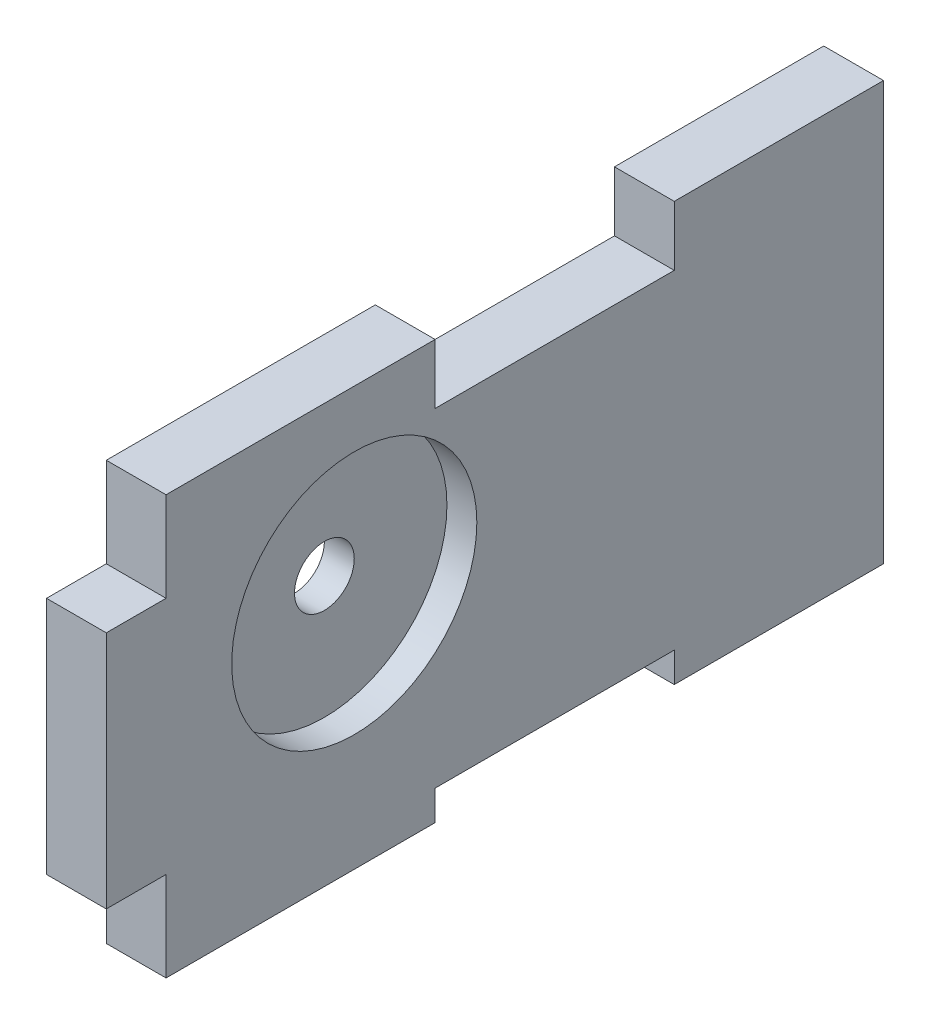
ISO-10303-21;
HEADER;
FILE_DESCRIPTION(('STEP AP214'),'2;1');
FILE_NAME('part.step','',(''),(''),'','','');
FILE_SCHEMA(('AUTOMOTIVE_DESIGN { 1 0 10303 214 1 1 1 1 }'));
ENDSEC;
DATA;
#1=APPLICATION_CONTEXT('core data for automotive mechanical design processes');
#2=APPLICATION_PROTOCOL_DEFINITION('international standard','automotive_design',2000,#1);
#3=PRODUCT_CONTEXT('',#1,'mechanical');
#4=PRODUCT('Part','Part','',(#3));
#5=PRODUCT_RELATED_PRODUCT_CATEGORY('part','',(#4));
#6=PRODUCT_DEFINITION_FORMATION('','',#4);
#7=PRODUCT_DEFINITION_CONTEXT('part definition',#1,'design');
#8=PRODUCT_DEFINITION('design','',#6,#7);
#9=PRODUCT_DEFINITION_SHAPE('','',#8);
#10=(LENGTH_UNIT() NAMED_UNIT(*) SI_UNIT(.MILLI.,.METRE.));
#11=(NAMED_UNIT(*) PLANE_ANGLE_UNIT() SI_UNIT($,.RADIAN.));
#12=(NAMED_UNIT(*) SI_UNIT($,.STERADIAN.) SOLID_ANGLE_UNIT());
#13=UNCERTAINTY_MEASURE_WITH_UNIT(LENGTH_MEASURE(1.E-05),#10,'distance_accuracy_value','');
#14=(GEOMETRIC_REPRESENTATION_CONTEXT(3) GLOBAL_UNCERTAINTY_ASSIGNED_CONTEXT((#13)) GLOBAL_UNIT_ASSIGNED_CONTEXT((#10,
#11,#12)) REPRESENTATION_CONTEXT('',''));
#15=CARTESIAN_POINT('',(0.,0.,0.));
#16=DIRECTION('',(0.,0.,1.));
#17=DIRECTION('',(1.,0.,0.));
#18=AXIS2_PLACEMENT_3D('',#15,#16,#17);
#19=CARTESIAN_POINT('',(10.,0.,35.));
#20=DIRECTION('',(0.,0.,1.));
#21=DIRECTION('',(1.,0.,0.));
#22=AXIS2_PLACEMENT_3D('',#19,#20,#21);
#23=PLANE('',#22);
#24=DIRECTION('',(0.,1.,0.));
#25=VECTOR('',#24,1.);
#26=CARTESIAN_POINT('',(0.,0.,35.));
#27=LINE('',#26,#25);
#28=CARTESIAN_POINT('',(0.,0.,35.));
#29=VERTEX_POINT('',#28);
#30=CARTESIAN_POINT('',(0.,5.00000000000002,35.));
#31=VERTEX_POINT('',#30);
#32=EDGE_CURVE('E191',#29,#31,#27,.T.);
#33=ORIENTED_EDGE('',*,*,#32,.F.);
#34=DIRECTION('',(-1.,0.,0.));
#35=VECTOR('',#34,1.);
#36=CARTESIAN_POINT('',(10.,0.,35.));
#37=LINE('',#36,#35);
#38=CARTESIAN_POINT('',(10.,0.,35.));
#39=VERTEX_POINT('',#38);
#40=EDGE_CURVE('E11',#39,#29,#37,.T.);
#41=ORIENTED_EDGE('',*,*,#40,.F.);
#42=DIRECTION('',(0.,1.,0.));
#43=VECTOR('',#42,1.);
#44=CARTESIAN_POINT('',(10.,0.,35.));
#45=LINE('',#44,#43);
#46=CARTESIAN_POINT('',(10.,5.00000000000002,35.));
#47=VERTEX_POINT('',#46);
#48=EDGE_CURVE('E233',#39,#47,#45,.T.);
#49=ORIENTED_EDGE('',*,*,#48,.T.);
#50=DIRECTION('',(-1.,0.,0.));
#51=VECTOR('',#50,1.);
#52=CARTESIAN_POINT('',(10.,5.00000000000002,35.));
#53=LINE('',#52,#51);
#54=EDGE_CURVE('E116',#47,#31,#53,.T.);
#55=ORIENTED_EDGE('',*,*,#54,.T.);
#56=EDGE_LOOP('',(#33,#41,#49,#55));
#57=FACE_BOUND('',#56,.T.);
#58=ADVANCED_FACE('F37',(#57),#23,.T.);
#59=CARTESIAN_POINT('',(10.,0.,0.));
#60=DIRECTION('',(0.,1.,0.));
#61=DIRECTION('',(0.,0.,1.));
#62=AXIS2_PLACEMENT_3D('',#59,#60,#61);
#63=PLANE('',#62);
#64=DIRECTION('',(0.,0.,-1.));
#65=VECTOR('',#64,1.);
#66=CARTESIAN_POINT('',(0.,0.,0.));
#67=LINE('',#66,#65);
#68=CARTESIAN_POINT('',(0.,0.,0.));
#69=VERTEX_POINT('',#68);
#70=EDGE_CURVE('E194',#29,#69,#67,.T.);
#71=ORIENTED_EDGE('',*,*,#70,.T.);
#72=DIRECTION('',(-1.,0.,0.));
#73=VECTOR('',#72,1.);
#74=CARTESIAN_POINT('',(10.,0.,0.));
#75=LINE('',#74,#73);
#76=CARTESIAN_POINT('',(10.,0.,0.));
#77=VERTEX_POINT('',#76);
#78=EDGE_CURVE('E44',#77,#69,#75,.T.);
#79=ORIENTED_EDGE('',*,*,#78,.F.);
#80=DIRECTION('',(0.,0.,-1.));
#81=VECTOR('',#80,1.);
#82=CARTESIAN_POINT('',(10.,0.,0.));
#83=LINE('',#82,#81);
#84=EDGE_CURVE('E173',#39,#77,#83,.T.);
#85=ORIENTED_EDGE('',*,*,#84,.F.);
#86=ORIENTED_EDGE('',*,*,#40,.T.);
#87=EDGE_LOOP('',(#71,#79,#85,#86));
#88=FACE_BOUND('',#87,.T.);
#89=ADVANCED_FACE('F268',(#88),#63,.F.);
#90=CARTESIAN_POINT('',(10.,0.,0.));
#91=DIRECTION('',(0.,0.,-1.));
#92=DIRECTION('',(0.,1.,0.));
#93=AXIS2_PLACEMENT_3D('',#90,#91,#92);
#94=PLANE('',#93);
#95=DIRECTION('',(-1.,0.,0.));
#96=VECTOR('',#95,1.);
#97=CARTESIAN_POINT('',(5.,55.,0.));
#98=LINE('',#97,#96);
#99=CARTESIAN_POINT('',(5.,55.,0.));
#100=VERTEX_POINT('',#99);
#101=CARTESIAN_POINT('',(0.,55.,0.));
#102=VERTEX_POINT('',#101);
#103=EDGE_CURVE('E389',#100,#102,#98,.T.);
#104=ORIENTED_EDGE('',*,*,#103,.T.);
#105=DIRECTION('',(0.,-1.,0.));
#106=VECTOR('',#105,1.);
#107=CARTESIAN_POINT('',(0.,0.,0.));
#108=LINE('',#107,#106);
#109=CARTESIAN_POINT('',(0.,70.,0.));
#110=VERTEX_POINT('',#109);
#111=EDGE_CURVE('E199',#110,#102,#108,.T.);
#112=ORIENTED_EDGE('',*,*,#111,.F.);
#113=DIRECTION('',(-1.,0.,0.));
#114=VECTOR('',#113,1.);
#115=CARTESIAN_POINT('',(10.,70.,0.));
#116=LINE('',#115,#114);
#117=CARTESIAN_POINT('',(10.,70.,0.));
#118=VERTEX_POINT('',#117);
#119=EDGE_CURVE('E256',#118,#110,#116,.T.);
#120=ORIENTED_EDGE('',*,*,#119,.F.);
#121=DIRECTION('',(0.,-1.,0.));
#122=VECTOR('',#121,1.);
#123=CARTESIAN_POINT('',(10.,0.,0.));
#124=LINE('',#123,#122);
#125=EDGE_CURVE('E265',#118,#77,#124,.T.);
#126=ORIENTED_EDGE('',*,*,#125,.T.);
#127=ORIENTED_EDGE('',*,*,#78,.T.);
#128=CARTESIAN_POINT('',(0.,15.,0.));
#129=VERTEX_POINT('',#128);
#130=EDGE_CURVE('E198',#129,#69,#108,.T.);
#131=ORIENTED_EDGE('',*,*,#130,.F.);
#132=DIRECTION('',(-1.,0.,0.));
#133=VECTOR('',#132,1.);
#134=CARTESIAN_POINT('',(5.,15.,0.));
#135=LINE('',#134,#133);
#136=CARTESIAN_POINT('',(5.,15.,0.));
#137=VERTEX_POINT('',#136);
#138=EDGE_CURVE('E51',#137,#129,#135,.T.);
#139=ORIENTED_EDGE('',*,*,#138,.F.);
#140=DIRECTION('',(0.,-1.,0.));
#141=VECTOR('',#140,1.);
#142=CARTESIAN_POINT('',(5.,15.,0.));
#143=LINE('',#142,#141);
#144=EDGE_CURVE('E391',#100,#137,#143,.T.);
#145=ORIENTED_EDGE('',*,*,#144,.F.);
#146=EDGE_LOOP('',(#104,#112,#120,#126,#127,#131,#139,#145));
#147=FACE_BOUND('',#146,.T.);
#148=ADVANCED_FACE('F263',(#147),#94,.T.);
#149=CARTESIAN_POINT('',(10.,70.,0.));
#150=DIRECTION('',(0.,1.,0.));
#151=DIRECTION('',(0.,0.,1.));
#152=AXIS2_PLACEMENT_3D('',#149,#150,#151);
#153=PLANE('',#152);
#154=DIRECTION('',(0.,0.,-1.));
#155=VECTOR('',#154,1.);
#156=CARTESIAN_POINT('',(0.,70.,0.));
#157=LINE('',#156,#155);
#158=CARTESIAN_POINT('',(0.,70.,35.));
#159=VERTEX_POINT('',#158);
#160=EDGE_CURVE('E202',#159,#110,#157,.T.);
#161=ORIENTED_EDGE('',*,*,#160,.F.);
#162=DIRECTION('',(-1.,0.,0.));
#163=VECTOR('',#162,1.);
#164=CARTESIAN_POINT('',(10.,70.,35.));
#165=LINE('',#164,#163);
#166=CARTESIAN_POINT('',(10.,70.,35.));
#167=VERTEX_POINT('',#166);
#168=EDGE_CURVE('E254',#167,#159,#165,.T.);
#169=ORIENTED_EDGE('',*,*,#168,.F.);
#170=DIRECTION('',(0.,0.,-1.));
#171=VECTOR('',#170,1.);
#172=CARTESIAN_POINT('',(10.,70.,0.));
#173=LINE('',#172,#171);
#174=EDGE_CURVE('E347',#167,#118,#173,.T.);
#175=ORIENTED_EDGE('',*,*,#174,.T.);
#176=ORIENTED_EDGE('',*,*,#119,.T.);
#177=EDGE_LOOP('',(#161,#169,#175,#176));
#178=FACE_BOUND('',#177,.T.);
#179=ADVANCED_FACE('F280',(#178),#153,.T.);
#180=CARTESIAN_POINT('',(10.,0.,35.));
#181=DIRECTION('',(0.,0.,-1.));
#182=DIRECTION('',(-1.,0.,0.));
#183=AXIS2_PLACEMENT_3D('',#180,#181,#182);
#184=PLANE('',#183);
#185=DIRECTION('',(0.,-1.,0.));
#186=VECTOR('',#185,1.);
#187=CARTESIAN_POINT('',(0.,0.,35.));
#188=LINE('',#187,#186);
#189=CARTESIAN_POINT('',(0.,60.,35.));
#190=VERTEX_POINT('',#189);
#191=EDGE_CURVE('E205',#159,#190,#188,.T.);
#192=ORIENTED_EDGE('',*,*,#191,.T.);
#193=DIRECTION('',(-1.,0.,0.));
#194=VECTOR('',#193,1.);
#195=CARTESIAN_POINT('',(10.,60.,35.));
#196=LINE('',#195,#194);
#197=CARTESIAN_POINT('',(10.,60.,35.));
#198=VERTEX_POINT('',#197);
#199=EDGE_CURVE('E252',#198,#190,#196,.T.);
#200=ORIENTED_EDGE('',*,*,#199,.F.);
#201=DIRECTION('',(0.,-1.,0.));
#202=VECTOR('',#201,1.);
#203=CARTESIAN_POINT('',(10.,0.,35.));
#204=LINE('',#203,#202);
#205=EDGE_CURVE('E343',#167,#198,#204,.T.);
#206=ORIENTED_EDGE('',*,*,#205,.F.);
#207=ORIENTED_EDGE('',*,*,#168,.T.);
#208=EDGE_LOOP('',(#192,#200,#206,#207));
#209=FACE_BOUND('',#208,.T.);
#210=ADVANCED_FACE('F322',(#209),#184,.F.);
#211=CARTESIAN_POINT('',(10.,60.,0.));
#212=DIRECTION('',(0.,1.,0.));
#213=DIRECTION('',(0.,0.,1.));
#214=AXIS2_PLACEMENT_3D('',#211,#212,#213);
#215=PLANE('',#214);
#216=DIRECTION('',(0.,0.,-1.));
#217=VECTOR('',#216,1.);
#218=CARTESIAN_POINT('',(0.,60.,0.));
#219=LINE('',#218,#217);
#220=CARTESIAN_POINT('',(0.,60.,75.));
#221=VERTEX_POINT('',#220);
#222=EDGE_CURVE('E209',#221,#190,#219,.T.);
#223=ORIENTED_EDGE('',*,*,#222,.F.);
#224=DIRECTION('',(-1.,0.,0.));
#225=VECTOR('',#224,1.);
#226=CARTESIAN_POINT('',(10.,60.,75.));
#227=LINE('',#226,#225);
#228=CARTESIAN_POINT('',(10.,60.,75.));
#229=VERTEX_POINT('',#228);
#230=EDGE_CURVE('E250',#229,#221,#227,.T.);
#231=ORIENTED_EDGE('',*,*,#230,.F.);
#232=DIRECTION('',(0.,0.,-1.));
#233=VECTOR('',#232,1.);
#234=CARTESIAN_POINT('',(10.,60.,0.));
#235=LINE('',#234,#233);
#236=EDGE_CURVE('E339',#229,#198,#235,.T.);
#237=ORIENTED_EDGE('',*,*,#236,.T.);
#238=ORIENTED_EDGE('',*,*,#199,.T.);
#239=EDGE_LOOP('',(#223,#231,#237,#238));
#240=FACE_BOUND('',#239,.T.);
#241=ADVANCED_FACE('F318',(#240),#215,.T.);
#242=CARTESIAN_POINT('',(10.,0.,75.));
#243=DIRECTION('',(0.,0.,-1.));
#244=DIRECTION('',(-1.,0.,0.));
#245=AXIS2_PLACEMENT_3D('',#242,#243,#244);
#246=PLANE('',#245);
#247=DIRECTION('',(0.,-1.,0.));
#248=VECTOR('',#247,1.);
#249=CARTESIAN_POINT('',(0.,0.,75.));
#250=LINE('',#249,#248);
#251=CARTESIAN_POINT('',(0.,70.,75.));
#252=VERTEX_POINT('',#251);
#253=EDGE_CURVE('E212',#252,#221,#250,.T.);
#254=ORIENTED_EDGE('',*,*,#253,.F.);
#255=DIRECTION('',(-1.,0.,0.));
#256=VECTOR('',#255,1.);
#257=CARTESIAN_POINT('',(10.,70.,75.));
#258=LINE('',#257,#256);
#259=CARTESIAN_POINT('',(10.,70.,75.));
#260=VERTEX_POINT('',#259);
#261=EDGE_CURVE('E248',#260,#252,#258,.T.);
#262=ORIENTED_EDGE('',*,*,#261,.F.);
#263=DIRECTION('',(0.,-1.,0.));
#264=VECTOR('',#263,1.);
#265=CARTESIAN_POINT('',(10.,0.,75.));
#266=LINE('',#265,#264);
#267=EDGE_CURVE('E342',#260,#229,#266,.T.);
#268=ORIENTED_EDGE('',*,*,#267,.T.);
#269=ORIENTED_EDGE('',*,*,#230,.T.);
#270=EDGE_LOOP('',(#254,#262,#268,#269));
#271=FACE_BOUND('',#270,.T.);
#272=ADVANCED_FACE('F314',(#271),#246,.T.);
#273=CARTESIAN_POINT('',(0.,70.,120.));
#274=VERTEX_POINT('',#273);
#275=EDGE_CURVE('E206',#274,#252,#157,.T.);
#276=ORIENTED_EDGE('',*,*,#275,.F.);
#277=DIRECTION('',(-1.,0.,0.));
#278=VECTOR('',#277,1.);
#279=CARTESIAN_POINT('',(10.,70.,120.));
#280=LINE('',#279,#278);
#281=CARTESIAN_POINT('',(10.,70.,120.));
#282=VERTEX_POINT('',#281);
#283=EDGE_CURVE('E246',#282,#274,#280,.T.);
#284=ORIENTED_EDGE('',*,*,#283,.F.);
#285=EDGE_CURVE('E345',#282,#260,#173,.T.);
#286=ORIENTED_EDGE('',*,*,#285,.T.);
#287=ORIENTED_EDGE('',*,*,#261,.T.);
#288=EDGE_LOOP('',(#276,#284,#286,#287));
#289=FACE_BOUND('',#288,.T.);
#290=ADVANCED_FACE('F310',(#289),#153,.T.);
#291=CARTESIAN_POINT('',(10.,0.,120.));
#292=DIRECTION('',(0.,0.,-1.));
#293=DIRECTION('',(-1.,0.,0.));
#294=AXIS2_PLACEMENT_3D('',#291,#292,#293);
#295=PLANE('',#294);
#296=DIRECTION('',(0.,-1.,0.));
#297=VECTOR('',#296,1.);
#298=CARTESIAN_POINT('',(0.,0.,120.));
#299=LINE('',#298,#297);
#300=CARTESIAN_POINT('',(0.,55.,120.));
#301=VERTEX_POINT('',#300);
#302=EDGE_CURVE('E215',#274,#301,#299,.T.);
#303=ORIENTED_EDGE('',*,*,#302,.T.);
#304=DIRECTION('',(-1.,0.,0.));
#305=VECTOR('',#304,1.);
#306=CARTESIAN_POINT('',(10.,55.,120.));
#307=LINE('',#306,#305);
#308=CARTESIAN_POINT('',(10.,55.,120.));
#309=VERTEX_POINT('',#308);
#310=EDGE_CURVE('E244',#309,#301,#307,.T.);
#311=ORIENTED_EDGE('',*,*,#310,.F.);
#312=DIRECTION('',(0.,-1.,0.));
#313=VECTOR('',#312,1.);
#314=CARTESIAN_POINT('',(10.,0.,120.));
#315=LINE('',#314,#313);
#316=EDGE_CURVE('E351',#282,#309,#315,.T.);
#317=ORIENTED_EDGE('',*,*,#316,.F.);
#318=ORIENTED_EDGE('',*,*,#283,.T.);
#319=EDGE_LOOP('',(#303,#311,#317,#318));
#320=FACE_BOUND('',#319,.T.);
#321=ADVANCED_FACE('F306',(#320),#295,.F.);
#322=CARTESIAN_POINT('',(10.,55.,0.));
#323=DIRECTION('',(0.,1.,0.));
#324=DIRECTION('',(0.,0.,1.));
#325=AXIS2_PLACEMENT_3D('',#322,#323,#324);
#326=PLANE('',#325);
#327=DIRECTION('',(0.,0.,-1.));
#328=VECTOR('',#327,1.);
#329=CARTESIAN_POINT('',(0.,55.,0.));
#330=LINE('',#329,#328);
#331=CARTESIAN_POINT('',(0.,55.,130.));
#332=VERTEX_POINT('',#331);
#333=EDGE_CURVE('E218',#332,#301,#330,.T.);
#334=ORIENTED_EDGE('',*,*,#333,.F.);
#335=DIRECTION('',(-1.,0.,0.));
#336=VECTOR('',#335,1.);
#337=CARTESIAN_POINT('',(10.,55.,130.));
#338=LINE('',#337,#336);
#339=CARTESIAN_POINT('',(10.,55.,130.));
#340=VERTEX_POINT('',#339);
#341=EDGE_CURVE('E242',#340,#332,#338,.T.);
#342=ORIENTED_EDGE('',*,*,#341,.F.);
#343=DIRECTION('',(0.,0.,-1.));
#344=VECTOR('',#343,1.);
#345=CARTESIAN_POINT('',(10.,55.,0.));
#346=LINE('',#345,#344);
#347=EDGE_CURVE('E353',#340,#309,#346,.T.);
#348=ORIENTED_EDGE('',*,*,#347,.T.);
#349=ORIENTED_EDGE('',*,*,#310,.T.);
#350=EDGE_LOOP('',(#334,#342,#348,#349));
#351=FACE_BOUND('',#350,.T.);
#352=ADVANCED_FACE('F302',(#351),#326,.T.);
#353=CARTESIAN_POINT('',(10.,0.,130.));
#354=DIRECTION('',(0.,0.,-1.));
#355=DIRECTION('',(-1.,0.,0.));
#356=AXIS2_PLACEMENT_3D('',#353,#354,#355);
#357=PLANE('',#356);
#358=DIRECTION('',(0.,-1.,0.));
#359=VECTOR('',#358,1.);
#360=CARTESIAN_POINT('',(0.,0.,130.));
#361=LINE('',#360,#359);
#362=CARTESIAN_POINT('',(0.,15.,130.));
#363=VERTEX_POINT('',#362);
#364=EDGE_CURVE('E221',#332,#363,#361,.T.);
#365=ORIENTED_EDGE('',*,*,#364,.T.);
#366=DIRECTION('',(-1.,0.,0.));
#367=VECTOR('',#366,1.);
#368=CARTESIAN_POINT('',(10.,15.,130.));
#369=LINE('',#368,#367);
#370=CARTESIAN_POINT('',(10.,15.,130.));
#371=VERTEX_POINT('',#370);
#372=EDGE_CURVE('E239',#371,#363,#369,.T.);
#373=ORIENTED_EDGE('',*,*,#372,.F.);
#374=DIRECTION('',(0.,-1.,0.));
#375=VECTOR('',#374,1.);
#376=CARTESIAN_POINT('',(10.,0.,130.));
#377=LINE('',#376,#375);
#378=EDGE_CURVE('E356',#340,#371,#377,.T.);
#379=ORIENTED_EDGE('',*,*,#378,.F.);
#380=ORIENTED_EDGE('',*,*,#341,.T.);
#381=EDGE_LOOP('',(#365,#373,#379,#380));
#382=FACE_BOUND('',#381,.T.);
#383=ADVANCED_FACE('F295',(#382),#357,.F.);
#384=CARTESIAN_POINT('',(10.,15.,0.));
#385=DIRECTION('',(0.,1.,0.));
#386=DIRECTION('',(0.,0.,1.));
#387=AXIS2_PLACEMENT_3D('',#384,#385,#386);
#388=PLANE('',#387);
#389=DIRECTION('',(0.,0.,-1.));
#390=VECTOR('',#389,1.);
#391=CARTESIAN_POINT('',(0.,15.,0.));
#392=LINE('',#391,#390);
#393=CARTESIAN_POINT('',(0.,15.,120.));
#394=VERTEX_POINT('',#393);
#395=EDGE_CURVE('E223',#363,#394,#392,.T.);
#396=ORIENTED_EDGE('',*,*,#395,.T.);
#397=DIRECTION('',(-1.,0.,0.));
#398=VECTOR('',#397,1.);
#399=CARTESIAN_POINT('',(10.,15.,120.));
#400=LINE('',#399,#398);
#401=CARTESIAN_POINT('',(10.,15.,120.));
#402=VERTEX_POINT('',#401);
#403=EDGE_CURVE('E237',#402,#394,#400,.T.);
#404=ORIENTED_EDGE('',*,*,#403,.F.);
#405=DIRECTION('',(0.,0.,-1.));
#406=VECTOR('',#405,1.);
#407=CARTESIAN_POINT('',(10.,15.,0.));
#408=LINE('',#407,#406);
#409=EDGE_CURVE('E357',#371,#402,#408,.T.);
#410=ORIENTED_EDGE('',*,*,#409,.F.);
#411=ORIENTED_EDGE('',*,*,#372,.T.);
#412=EDGE_LOOP('',(#396,#404,#410,#411));
#413=FACE_BOUND('',#412,.T.);
#414=ADVANCED_FACE('F290',(#413),#388,.F.);
#415=CARTESIAN_POINT('',(10.,0.,120.));
#416=DIRECTION('',(0.,0.,1.));
#417=DIRECTION('',(1.,0.,0.));
#418=AXIS2_PLACEMENT_3D('',#415,#416,#417);
#419=PLANE('',#418);
#420=DIRECTION('',(0.,1.,0.));
#421=VECTOR('',#420,1.);
#422=CARTESIAN_POINT('',(0.,0.,120.));
#423=LINE('',#422,#421);
#424=CARTESIAN_POINT('',(0.,0.,120.));
#425=VERTEX_POINT('',#424);
#426=EDGE_CURVE('E226',#425,#394,#423,.T.);
#427=ORIENTED_EDGE('',*,*,#426,.F.);
#428=DIRECTION('',(-1.,0.,0.));
#429=VECTOR('',#428,1.);
#430=CARTESIAN_POINT('',(10.,0.,120.));
#431=LINE('',#430,#429);
#432=CARTESIAN_POINT('',(10.,0.,120.));
#433=VERTEX_POINT('',#432);
#434=EDGE_CURVE('E181',#433,#425,#431,.T.);
#435=ORIENTED_EDGE('',*,*,#434,.F.);
#436=DIRECTION('',(0.,1.,0.));
#437=VECTOR('',#436,1.);
#438=CARTESIAN_POINT('',(10.,0.,120.));
#439=LINE('',#438,#437);
#440=EDGE_CURVE('E170',#433,#402,#439,.T.);
#441=ORIENTED_EDGE('',*,*,#440,.T.);
#442=ORIENTED_EDGE('',*,*,#403,.T.);
#443=EDGE_LOOP('',(#427,#435,#441,#442));
#444=FACE_BOUND('',#443,.T.);
#445=ADVANCED_FACE('F284',(#444),#419,.T.);
#446=CARTESIAN_POINT('',(0.,0.,75.));
#447=VERTEX_POINT('',#446);
#448=EDGE_CURVE('E178',#425,#447,#67,.T.);
#449=ORIENTED_EDGE('',*,*,#448,.T.);
#450=DIRECTION('',(-1.,0.,0.));
#451=VECTOR('',#450,1.);
#452=CARTESIAN_POINT('',(10.,0.,75.));
#453=LINE('',#452,#451);
#454=CARTESIAN_POINT('',(10.,0.,75.));
#455=VERTEX_POINT('',#454);
#456=EDGE_CURVE('E175',#455,#447,#453,.T.);
#457=ORIENTED_EDGE('',*,*,#456,.F.);
#458=EDGE_CURVE('E163',#433,#455,#83,.T.);
#459=ORIENTED_EDGE('',*,*,#458,.F.);
#460=ORIENTED_EDGE('',*,*,#434,.T.);
#461=EDGE_LOOP('',(#449,#457,#459,#460));
#462=FACE_BOUND('',#461,.T.);
#463=ADVANCED_FACE('F176',(#462),#63,.F.);
#464=CARTESIAN_POINT('',(10.,0.,75.));
#465=DIRECTION('',(0.,0.,1.));
#466=DIRECTION('',(1.,0.,0.));
#467=AXIS2_PLACEMENT_3D('',#464,#465,#466);
#468=PLANE('',#467);
#469=DIRECTION('',(0.,1.,0.));
#470=VECTOR('',#469,1.);
#471=CARTESIAN_POINT('',(0.,0.,75.));
#472=LINE('',#471,#470);
#473=CARTESIAN_POINT('',(0.,5.00000000000002,75.));
#474=VERTEX_POINT('',#473);
#475=EDGE_CURVE('E229',#447,#474,#472,.T.);
#476=ORIENTED_EDGE('',*,*,#475,.T.);
#477=DIRECTION('',(-1.,0.,0.));
#478=VECTOR('',#477,1.);
#479=CARTESIAN_POINT('',(10.,5.00000000000002,75.));
#480=LINE('',#479,#478);
#481=CARTESIAN_POINT('',(10.,5.00000000000002,75.));
#482=VERTEX_POINT('',#481);
#483=EDGE_CURVE('E182',#482,#474,#480,.T.);
#484=ORIENTED_EDGE('',*,*,#483,.F.);
#485=DIRECTION('',(0.,1.,0.));
#486=VECTOR('',#485,1.);
#487=CARTESIAN_POINT('',(10.,0.,75.));
#488=LINE('',#487,#486);
#489=EDGE_CURVE('E167',#455,#482,#488,.T.);
#490=ORIENTED_EDGE('',*,*,#489,.F.);
#491=ORIENTED_EDGE('',*,*,#456,.T.);
#492=EDGE_LOOP('',(#476,#484,#490,#491));
#493=FACE_BOUND('',#492,.T.);
#494=ADVANCED_FACE('F184',(#493),#468,.F.);
#495=CARTESIAN_POINT('',(10.,5.00000000000002,0.));
#496=DIRECTION('',(0.,1.,0.));
#497=DIRECTION('',(0.,0.,1.));
#498=AXIS2_PLACEMENT_3D('',#495,#496,#497);
#499=PLANE('',#498);
#500=DIRECTION('',(0.,0.,-1.));
#501=VECTOR('',#500,1.);
#502=CARTESIAN_POINT('',(0.,5.00000000000002,0.));
#503=LINE('',#502,#501);
#504=EDGE_CURVE('E231',#474,#31,#503,.T.);
#505=ORIENTED_EDGE('',*,*,#504,.T.);
#506=ORIENTED_EDGE('',*,*,#54,.F.);
#507=DIRECTION('',(0.,0.,-1.));
#508=VECTOR('',#507,1.);
#509=CARTESIAN_POINT('',(10.,5.00000000000002,0.));
#510=LINE('',#509,#508);
#511=EDGE_CURVE('E60',#482,#47,#510,.T.);
#512=ORIENTED_EDGE('',*,*,#511,.F.);
#513=ORIENTED_EDGE('',*,*,#483,.T.);
#514=EDGE_LOOP('',(#505,#506,#512,#513));
#515=FACE_BOUND('',#514,.T.);
#516=ADVANCED_FACE('F289',(#515),#499,.F.);
#517=CARTESIAN_POINT('',(10.,0.,0.));
#518=DIRECTION('',(1.,0.,0.));
#519=DIRECTION('',(0.,0.,-1.));
#520=AXIS2_PLACEMENT_3D('',#517,#518,#519);
#521=PLANE('',#520);
#522=CARTESIAN_POINT('',(10.,40.,88.52));
#523=DIRECTION('',(1.,0.,0.));
#524=DIRECTION('',(0.,0.,-1.));
#525=AXIS2_PLACEMENT_3D('',#522,#523,#524);
#526=CIRCLE('',#525,20.5);
#527=CARTESIAN_POINT('',(10.,40.,68.02));
#528=VERTEX_POINT('',#527);
#529=EDGE_CURVE('E364',#528,#528,#526,.T.);
#530=ORIENTED_EDGE('',*,*,#529,.F.);
#531=EDGE_LOOP('',(#530));
#532=FACE_BOUND('',#531,.T.);
#533=ORIENTED_EDGE('',*,*,#48,.F.);
#534=ORIENTED_EDGE('',*,*,#84,.T.);
#535=ORIENTED_EDGE('',*,*,#125,.F.);
#536=ORIENTED_EDGE('',*,*,#174,.F.);
#537=ORIENTED_EDGE('',*,*,#205,.T.);
#538=ORIENTED_EDGE('',*,*,#236,.F.);
#539=ORIENTED_EDGE('',*,*,#267,.F.);
#540=ORIENTED_EDGE('',*,*,#285,.F.);
#541=ORIENTED_EDGE('',*,*,#316,.T.);
#542=ORIENTED_EDGE('',*,*,#347,.F.);
#543=ORIENTED_EDGE('',*,*,#378,.T.);
#544=ORIENTED_EDGE('',*,*,#409,.T.);
#545=ORIENTED_EDGE('',*,*,#440,.F.);
#546=ORIENTED_EDGE('',*,*,#458,.T.);
#547=ORIENTED_EDGE('',*,*,#489,.T.);
#548=ORIENTED_EDGE('',*,*,#511,.T.);
#549=EDGE_LOOP('',(#533,#534,#535,#536,#537,#538,#539,#540,#541,#542,#543,#544,#545,#546,#547,#548));
#550=FACE_BOUND('',#549,.T.);
#551=ADVANCED_FACE('F165',(#532,#550),#521,.T.);
#552=CARTESIAN_POINT('',(0.,0.,0.));
#553=DIRECTION('',(1.,0.,0.));
#554=DIRECTION('',(0.,0.,-1.));
#555=AXIS2_PLACEMENT_3D('',#552,#553,#554);
#556=PLANE('',#555);
#557=CARTESIAN_POINT('',(0.,26.5090909727527,17.11));
#558=DIRECTION('',(-1.,0.,0.));
#559=DIRECTION('',(0.,0.,1.));
#560=AXIS2_PLACEMENT_3D('',#557,#558,#559);
#561=CIRCLE('',#560,5.);
#562=CARTESIAN_POINT('',(0.,26.5090909727527,22.11));
#563=VERTEX_POINT('',#562);
#564=EDGE_CURVE('E415',#563,#563,#561,.T.);
#565=ORIENTED_EDGE('',*,*,#564,.F.);
#566=EDGE_LOOP('',(#565));
#567=FACE_BOUND('',#566,.T.);
#568=CARTESIAN_POINT('',(0.,33.,52.52));
#569=DIRECTION('',(-1.,0.,0.));
#570=DIRECTION('',(0.,0.,1.));
#571=AXIS2_PLACEMENT_3D('',#568,#569,#570);
#572=CIRCLE('',#571,5.00000000000001);
#573=CARTESIAN_POINT('',(0.,33.,57.52));
#574=VERTEX_POINT('',#573);
#575=EDGE_CURVE('E395',#574,#574,#572,.T.);
#576=ORIENTED_EDGE('',*,*,#575,.F.);
#577=EDGE_LOOP('',(#576));
#578=FACE_BOUND('',#577,.T.);
#579=CARTESIAN_POINT('',(0.,40.,88.52));
#580=DIRECTION('',(1.,0.,0.));
#581=DIRECTION('',(0.,0.,-1.));
#582=AXIS2_PLACEMENT_3D('',#579,#580,#581);
#583=CIRCLE('',#582,5.00000000000001);
#584=CARTESIAN_POINT('',(0.,40.,83.52));
#585=VERTEX_POINT('',#584);
#586=EDGE_CURVE('E420',#585,#585,#583,.T.);
#587=ORIENTED_EDGE('',*,*,#586,.T.);
#588=EDGE_LOOP('',(#587));
#589=FACE_BOUND('',#588,.T.);
#590=ORIENTED_EDGE('',*,*,#111,.T.);
#591=DIRECTION('',(0.,0.,-1.));
#592=VECTOR('',#591,1.);
#593=CARTESIAN_POINT('',(0.,55.,0.));
#594=LINE('',#593,#592);
#595=CARTESIAN_POINT('',(0.,55.,10.));
#596=VERTEX_POINT('',#595);
#597=EDGE_CURVE('E385',#596,#102,#594,.T.);
#598=ORIENTED_EDGE('',*,*,#597,.F.);
#599=DIRECTION('',(0.,1.,0.));
#600=VECTOR('',#599,1.);
#601=CARTESIAN_POINT('',(0.,15.,10.));
#602=LINE('',#601,#600);
#603=CARTESIAN_POINT('',(0.,15.,10.));
#604=VERTEX_POINT('',#603);
#605=EDGE_CURVE('E492',#604,#596,#602,.T.);
#606=ORIENTED_EDGE('',*,*,#605,.F.);
#607=DIRECTION('',(0.,0.,1.));
#608=VECTOR('',#607,1.);
#609=CARTESIAN_POINT('',(0.,15.,0.));
#610=LINE('',#609,#608);
#611=EDGE_CURVE('E496',#129,#604,#610,.T.);
#612=ORIENTED_EDGE('',*,*,#611,.F.);
#613=ORIENTED_EDGE('',*,*,#130,.T.);
#614=ORIENTED_EDGE('',*,*,#70,.F.);
#615=ORIENTED_EDGE('',*,*,#32,.T.);
#616=ORIENTED_EDGE('',*,*,#504,.F.);
#617=ORIENTED_EDGE('',*,*,#475,.F.);
#618=ORIENTED_EDGE('',*,*,#448,.F.);
#619=ORIENTED_EDGE('',*,*,#426,.T.);
#620=ORIENTED_EDGE('',*,*,#395,.F.);
#621=ORIENTED_EDGE('',*,*,#364,.F.);
#622=ORIENTED_EDGE('',*,*,#333,.T.);
#623=ORIENTED_EDGE('',*,*,#302,.F.);
#624=ORIENTED_EDGE('',*,*,#275,.T.);
#625=ORIENTED_EDGE('',*,*,#253,.T.);
#626=ORIENTED_EDGE('',*,*,#222,.T.);
#627=ORIENTED_EDGE('',*,*,#191,.F.);
#628=ORIENTED_EDGE('',*,*,#160,.T.);
#629=EDGE_LOOP('',(#590,#598,#606,#612,#613,#614,#615,#616,#617,#618,#619,#620,#621,#622,#623,
#624,#625,#626,#627,#628));
#630=FACE_BOUND('',#629,.T.);
#631=ADVANCED_FACE('F270',(#567,#578,#589,#630),#556,.F.);
#632=CARTESIAN_POINT('',(5.,40.,88.52));
#633=DIRECTION('',(1.,0.,0.));
#634=DIRECTION('',(0.,0.,-1.));
#635=AXIS2_PLACEMENT_3D('',#632,#633,#634);
#636=CYLINDRICAL_SURFACE('',#635,20.5);
#637=CARTESIAN_POINT('',(5.,40.,88.52));
#638=DIRECTION('',(1.,0.,0.));
#639=DIRECTION('',(0.,0.,-1.));
#640=AXIS2_PLACEMENT_3D('',#637,#638,#639);
#641=CIRCLE('',#640,20.5);
#642=CARTESIAN_POINT('',(5.,40.,68.02));
#643=VERTEX_POINT('',#642);
#644=EDGE_CURVE('E195',#643,#643,#641,.T.);
#645=ORIENTED_EDGE('',*,*,#644,.F.);
#646=EDGE_LOOP('',(#645));
#647=FACE_BOUND('',#646,.T.);
#648=ORIENTED_EDGE('',*,*,#529,.T.);
#649=EDGE_LOOP('',(#648));
#650=FACE_BOUND('',#649,.T.);
#651=ADVANCED_FACE('F430',(#647,#650),#636,.F.);
#652=CARTESIAN_POINT('',(5.,0.,0.));
#653=DIRECTION('',(1.,0.,0.));
#654=DIRECTION('',(0.,0.,-1.));
#655=AXIS2_PLACEMENT_3D('',#652,#653,#654);
#656=PLANE('',#655);
#657=CARTESIAN_POINT('',(5.,40.,88.52));
#658=DIRECTION('',(1.,0.,0.));
#659=DIRECTION('',(0.,0.,-1.));
#660=AXIS2_PLACEMENT_3D('',#657,#658,#659);
#661=CIRCLE('',#660,5.00000000000001);
#662=CARTESIAN_POINT('',(5.,40.,83.52));
#663=VERTEX_POINT('',#662);
#664=EDGE_CURVE('E414',#663,#663,#661,.T.);
#665=ORIENTED_EDGE('',*,*,#664,.F.);
#666=EDGE_LOOP('',(#665));
#667=FACE_BOUND('',#666,.T.);
#668=ORIENTED_EDGE('',*,*,#644,.T.);
#669=EDGE_LOOP('',(#668));
#670=FACE_BOUND('',#669,.T.);
#671=ADVANCED_FACE('F444',(#667,#670),#656,.T.);
#672=CARTESIAN_POINT('',(0.,40.,88.52));
#673=DIRECTION('',(1.,0.,0.));
#674=DIRECTION('',(0.,0.,-1.));
#675=AXIS2_PLACEMENT_3D('',#672,#673,#674);
#676=CYLINDRICAL_SURFACE('',#675,5.00000000000001);
#677=ORIENTED_EDGE('',*,*,#586,.F.);
#678=EDGE_LOOP('',(#677));
#679=FACE_BOUND('',#678,.T.);
#680=ORIENTED_EDGE('',*,*,#664,.T.);
#681=EDGE_LOOP('',(#680));
#682=FACE_BOUND('',#681,.T.);
#683=ADVANCED_FACE('F448',(#679,#682),#676,.F.);
#684=CARTESIAN_POINT('',(5.,33.,52.52));
#685=DIRECTION('',(-1.,0.,0.));
#686=DIRECTION('',(0.,0.,1.));
#687=AXIS2_PLACEMENT_3D('',#684,#685,#686);
#688=CYLINDRICAL_SURFACE('',#687,5.00000000000001);
#689=CARTESIAN_POINT('',(5.,33.,52.52));
#690=DIRECTION('',(-1.,0.,0.));
#691=DIRECTION('',(0.,0.,1.));
#692=AXIS2_PLACEMENT_3D('',#689,#690,#691);
#693=CIRCLE('',#692,5.00000000000001);
#694=CARTESIAN_POINT('',(5.,33.,57.52));
#695=VERTEX_POINT('',#694);
#696=EDGE_CURVE('E399',#695,#695,#693,.T.);
#697=ORIENTED_EDGE('',*,*,#696,.F.);
#698=EDGE_LOOP('',(#697));
#699=FACE_BOUND('',#698,.T.);
#700=ORIENTED_EDGE('',*,*,#575,.T.);
#701=EDGE_LOOP('',(#700));
#702=FACE_BOUND('',#701,.T.);
#703=ADVANCED_FACE('F452',(#699,#702),#688,.F.);
#704=CARTESIAN_POINT('',(5.,0.,0.));
#705=DIRECTION('',(-1.,0.,0.));
#706=DIRECTION('',(0.,0.,1.));
#707=AXIS2_PLACEMENT_3D('',#704,#705,#706);
#708=PLANE('',#707);
#709=ORIENTED_EDGE('',*,*,#696,.T.);
#710=EDGE_LOOP('',(#709));
#711=FACE_BOUND('',#710,.T.);
#712=ADVANCED_FACE('F456',(#711),#708,.T.);
#713=CARTESIAN_POINT('',(5.,26.5090909727527,17.11));
#714=DIRECTION('',(-1.,0.,0.));
#715=DIRECTION('',(0.,0.,1.));
#716=AXIS2_PLACEMENT_3D('',#713,#714,#715);
#717=CYLINDRICAL_SURFACE('',#716,5.);
#718=CARTESIAN_POINT('',(5.,26.5090909727527,17.11));
#719=DIRECTION('',(-1.,0.,0.));
#720=DIRECTION('',(0.,0.,1.));
#721=AXIS2_PLACEMENT_3D('',#718,#719,#720);
#722=CIRCLE('',#721,5.);
#723=CARTESIAN_POINT('',(5.,26.5090909727527,22.11));
#724=VERTEX_POINT('',#723);
#725=EDGE_CURVE('E411',#724,#724,#722,.T.);
#726=ORIENTED_EDGE('',*,*,#725,.F.);
#727=EDGE_LOOP('',(#726));
#728=FACE_BOUND('',#727,.T.);
#729=ORIENTED_EDGE('',*,*,#564,.T.);
#730=EDGE_LOOP('',(#729));
#731=FACE_BOUND('',#730,.T.);
#732=ADVANCED_FACE('F460',(#728,#731),#717,.F.);
#733=CARTESIAN_POINT('',(5.,0.,0.));
#734=DIRECTION('',(-1.,0.,0.));
#735=DIRECTION('',(0.,0.,1.));
#736=AXIS2_PLACEMENT_3D('',#733,#734,#735);
#737=PLANE('',#736);
#738=ORIENTED_EDGE('',*,*,#725,.T.);
#739=EDGE_LOOP('',(#738));
#740=FACE_BOUND('',#739,.T.);
#741=ADVANCED_FACE('F464',(#740),#737,.T.);
#742=CARTESIAN_POINT('',(5.,55.,0.));
#743=DIRECTION('',(0.,1.,0.));
#744=DIRECTION('',(0.,0.,1.));
#745=AXIS2_PLACEMENT_3D('',#742,#743,#744);
#746=PLANE('',#745);
#747=ORIENTED_EDGE('',*,*,#597,.T.);
#748=ORIENTED_EDGE('',*,*,#103,.F.);
#749=DIRECTION('',(0.,0.,-1.));
#750=VECTOR('',#749,1.);
#751=CARTESIAN_POINT('',(5.,55.,0.));
#752=LINE('',#751,#750);
#753=CARTESIAN_POINT('',(5.,55.,10.));
#754=VERTEX_POINT('',#753);
#755=EDGE_CURVE('E410',#754,#100,#752,.T.);
#756=ORIENTED_EDGE('',*,*,#755,.F.);
#757=DIRECTION('',(-1.,0.,0.));
#758=VECTOR('',#757,1.);
#759=CARTESIAN_POINT('',(5.,55.,10.));
#760=LINE('',#759,#758);
#761=EDGE_CURVE('E396',#754,#596,#760,.T.);
#762=ORIENTED_EDGE('',*,*,#761,.T.);
#763=EDGE_LOOP('',(#747,#748,#756,#762));
#764=FACE_BOUND('',#763,.T.);
#765=ADVANCED_FACE('F468',(#764),#746,.F.);
#766=CARTESIAN_POINT('',(5.,15.,10.));
#767=DIRECTION('',(0.,0.,1.));
#768=DIRECTION('',(0.,-1.,0.));
#769=AXIS2_PLACEMENT_3D('',#766,#767,#768);
#770=PLANE('',#769);
#771=ORIENTED_EDGE('',*,*,#605,.T.);
#772=ORIENTED_EDGE('',*,*,#761,.F.);
#773=DIRECTION('',(0.,1.,0.));
#774=VECTOR('',#773,1.);
#775=CARTESIAN_POINT('',(5.,15.,10.));
#776=LINE('',#775,#774);
#777=CARTESIAN_POINT('',(5.,15.,10.));
#778=VERTEX_POINT('',#777);
#779=EDGE_CURVE('E490',#778,#754,#776,.T.);
#780=ORIENTED_EDGE('',*,*,#779,.F.);
#781=DIRECTION('',(-1.,0.,0.));
#782=VECTOR('',#781,1.);
#783=CARTESIAN_POINT('',(5.,15.,10.));
#784=LINE('',#783,#782);
#785=EDGE_CURVE('E402',#778,#604,#784,.T.);
#786=ORIENTED_EDGE('',*,*,#785,.T.);
#787=EDGE_LOOP('',(#771,#772,#780,#786));
#788=FACE_BOUND('',#787,.T.);
#789=ADVANCED_FACE('F474',(#788),#770,.F.);
#790=CARTESIAN_POINT('',(5.,15.,0.));
#791=DIRECTION('',(0.,-1.,0.));
#792=DIRECTION('',(0.,0.,-1.));
#793=AXIS2_PLACEMENT_3D('',#790,#791,#792);
#794=PLANE('',#793);
#795=ORIENTED_EDGE('',*,*,#611,.T.);
#796=ORIENTED_EDGE('',*,*,#785,.F.);
#797=DIRECTION('',(0.,0.,1.));
#798=VECTOR('',#797,1.);
#799=CARTESIAN_POINT('',(5.,15.,0.));
#800=LINE('',#799,#798);
#801=EDGE_CURVE('E487',#137,#778,#800,.T.);
#802=ORIENTED_EDGE('',*,*,#801,.F.);
#803=ORIENTED_EDGE('',*,*,#138,.T.);
#804=EDGE_LOOP('',(#795,#796,#802,#803));
#805=FACE_BOUND('',#804,.T.);
#806=ADVANCED_FACE('F470',(#805),#794,.F.);
#807=CARTESIAN_POINT('',(5.,0.,0.));
#808=DIRECTION('',(1.,0.,0.));
#809=DIRECTION('',(0.,0.,-1.));
#810=AXIS2_PLACEMENT_3D('',#807,#808,#809);
#811=PLANE('',#810);
#812=ORIENTED_EDGE('',*,*,#144,.T.);
#813=ORIENTED_EDGE('',*,*,#801,.T.);
#814=ORIENTED_EDGE('',*,*,#779,.T.);
#815=ORIENTED_EDGE('',*,*,#755,.T.);
#816=EDGE_LOOP('',(#812,#813,#814,#815));
#817=FACE_BOUND('',#816,.T.);
#818=ADVANCED_FACE('F473',(#817),#811,.F.);
#819=CLOSED_SHELL('',(#58,#89,#148,#179,#210,#241,#272,#290,#321,#352,#383,#414,#445,#463,#494,
#516,#551,#631,#651,#671,#683,#703,#712,#732,#741,#765,#789,#806,#818));
#820=MANIFOLD_SOLID_BREP('B2',#819);
#821=ADVANCED_BREP_SHAPE_REPRESENTATION('',(#18,#820),#14);
#822=SHAPE_DEFINITION_REPRESENTATION(#9,#821);
ENDSEC;
END-ISO-10303-21;
